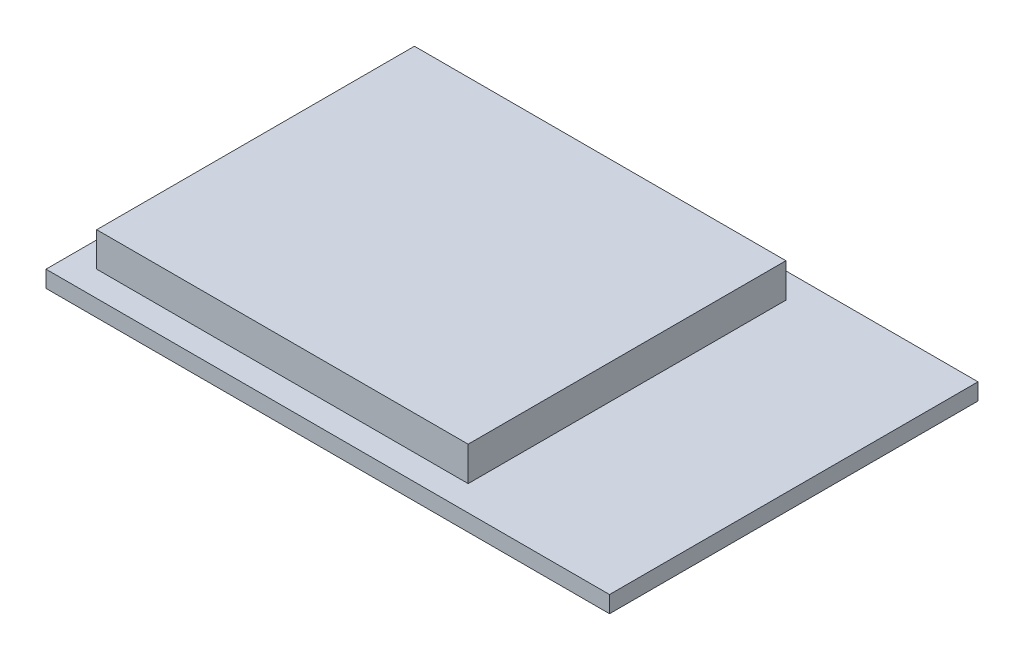
ISO-10303-21;
HEADER;
FILE_DESCRIPTION(('STEP AP214'),'2;1');
FILE_NAME('part.step','',(''),(''),'','','');
FILE_SCHEMA(('AUTOMOTIVE_DESIGN { 1 0 10303 214 1 1 1 1 }'));
ENDSEC;
DATA;
#1=APPLICATION_CONTEXT('core data for automotive mechanical design processes');
#2=APPLICATION_PROTOCOL_DEFINITION('international standard','automotive_design',2000,#1);
#3=PRODUCT_CONTEXT('',#1,'mechanical');
#4=PRODUCT('Part','Part','',(#3));
#5=PRODUCT_RELATED_PRODUCT_CATEGORY('part','',(#4));
#6=PRODUCT_DEFINITION_FORMATION('','',#4);
#7=PRODUCT_DEFINITION_CONTEXT('part definition',#1,'design');
#8=PRODUCT_DEFINITION('design','',#6,#7);
#9=PRODUCT_DEFINITION_SHAPE('','',#8);
#10=(LENGTH_UNIT() NAMED_UNIT(*) SI_UNIT(.MILLI.,.METRE.));
#11=(NAMED_UNIT(*) PLANE_ANGLE_UNIT() SI_UNIT($,.RADIAN.));
#12=(NAMED_UNIT(*) SI_UNIT($,.STERADIAN.) SOLID_ANGLE_UNIT());
#13=UNCERTAINTY_MEASURE_WITH_UNIT(LENGTH_MEASURE(1.E-05),#10,'distance_accuracy_value','');
#14=(GEOMETRIC_REPRESENTATION_CONTEXT(3) GLOBAL_UNCERTAINTY_ASSIGNED_CONTEXT((#13)) GLOBAL_UNIT_ASSIGNED_CONTEXT((#10,
#11,#12)) REPRESENTATION_CONTEXT('',''));
#15=CARTESIAN_POINT('',(0.,0.,0.));
#16=DIRECTION('',(0.,0.,1.));
#17=DIRECTION('',(1.,0.,0.));
#18=AXIS2_PLACEMENT_3D('',#15,#16,#17);
#19=CARTESIAN_POINT('',(0.,1.,0.));
#20=DIRECTION('',(0.,1.,0.));
#21=DIRECTION('',(0.,0.,1.));
#22=AXIS2_PLACEMENT_3D('',#19,#20,#21);
#23=PLANE('',#22);
#24=DIRECTION('',(0.,0.,1.));
#25=VECTOR('',#24,1.);
#26=CARTESIAN_POINT('',(0.,1.,-11.05));
#27=LINE('',#26,#25);
#28=CARTESIAN_POINT('',(0.,1.,-11.05));
#29=VERTEX_POINT('',#28);
#30=CARTESIAN_POINT('',(0.,1.,11.05));
#31=VERTEX_POINT('',#30);
#32=EDGE_CURVE('E149',#29,#31,#27,.T.);
#33=ORIENTED_EDGE('',*,*,#32,.T.);
#34=DIRECTION('',(1.,0.,0.));
#35=VECTOR('',#34,1.);
#36=CARTESIAN_POINT('',(0.,1.,11.05));
#37=LINE('',#36,#35);
#38=CARTESIAN_POINT('',(33.8,1.,11.05));
#39=VERTEX_POINT('',#38);
#40=EDGE_CURVE('E89',#31,#39,#37,.T.);
#41=ORIENTED_EDGE('',*,*,#40,.T.);
#42=DIRECTION('',(0.,0.,-1.));
#43=VECTOR('',#42,1.);
#44=CARTESIAN_POINT('',(33.8,1.,-11.05));
#45=LINE('',#44,#43);
#46=CARTESIAN_POINT('',(33.8,1.,-11.05));
#47=VERTEX_POINT('',#46);
#48=EDGE_CURVE('E152',#39,#47,#45,.T.);
#49=ORIENTED_EDGE('',*,*,#48,.T.);
#50=DIRECTION('',(-1.,0.,0.));
#51=VECTOR('',#50,1.);
#52=CARTESIAN_POINT('',(0.,1.,-11.05));
#53=LINE('',#52,#51);
#54=EDGE_CURVE('E61',#47,#29,#53,.T.);
#55=ORIENTED_EDGE('',*,*,#54,.T.);
#56=EDGE_LOOP('',(#33,#41,#49,#55));
#57=FACE_BOUND('',#56,.T.);
#58=DIRECTION('',(1.,0.,0.));
#59=VECTOR('',#58,1.);
#60=CARTESIAN_POINT('',(0.,1.,-9.53));
#61=LINE('',#60,#59);
#62=CARTESIAN_POINT('',(1.52,1.,-9.53));
#63=VERTEX_POINT('',#62);
#64=CARTESIAN_POINT('',(23.8,1.,-9.53));
#65=VERTEX_POINT('',#64);
#66=EDGE_CURVE('E145',#63,#65,#61,.T.);
#67=ORIENTED_EDGE('',*,*,#66,.T.);
#68=DIRECTION('',(0.,0.,1.));
#69=VECTOR('',#68,1.);
#70=CARTESIAN_POINT('',(23.8,1.,0.));
#71=LINE('',#70,#69);
#72=CARTESIAN_POINT('',(23.8,1.,9.53));
#73=VERTEX_POINT('',#72);
#74=EDGE_CURVE('E134',#65,#73,#71,.T.);
#75=ORIENTED_EDGE('',*,*,#74,.T.);
#76=DIRECTION('',(-1.,0.,0.));
#77=VECTOR('',#76,1.);
#78=CARTESIAN_POINT('',(0.,1.,9.53));
#79=LINE('',#78,#77);
#80=CARTESIAN_POINT('',(1.52,1.,9.53));
#81=VERTEX_POINT('',#80);
#82=EDGE_CURVE('E135',#73,#81,#79,.T.);
#83=ORIENTED_EDGE('',*,*,#82,.T.);
#84=DIRECTION('',(0.,0.,-1.));
#85=VECTOR('',#84,1.);
#86=CARTESIAN_POINT('',(1.52,1.,0.));
#87=LINE('',#86,#85);
#88=EDGE_CURVE('E138',#81,#63,#87,.T.);
#89=ORIENTED_EDGE('',*,*,#88,.T.);
#90=EDGE_LOOP('',(#67,#75,#83,#89));
#91=FACE_BOUND('',#90,.T.);
#92=ADVANCED_FACE('F37',(#57,#91),#23,.T.);
#93=CARTESIAN_POINT('',(0.,1.,-11.05));
#94=DIRECTION('',(1.,0.,0.));
#95=DIRECTION('',(0.,0.,-1.));
#96=AXIS2_PLACEMENT_3D('',#93,#94,#95);
#97=PLANE('',#96);
#98=DIRECTION('',(0.,0.,1.));
#99=VECTOR('',#98,1.);
#100=CARTESIAN_POINT('',(0.,0.,-11.05));
#101=LINE('',#100,#99);
#102=CARTESIAN_POINT('',(0.,0.,-11.05));
#103=VERTEX_POINT('',#102);
#104=CARTESIAN_POINT('',(0.,0.,11.05));
#105=VERTEX_POINT('',#104);
#106=EDGE_CURVE('E148',#103,#105,#101,.T.);
#107=ORIENTED_EDGE('',*,*,#106,.T.);
#108=DIRECTION('',(0.,-1.,0.));
#109=VECTOR('',#108,1.);
#110=CARTESIAN_POINT('',(0.,1.,11.05));
#111=LINE('',#110,#109);
#112=EDGE_CURVE('E11',#31,#105,#111,.T.);
#113=ORIENTED_EDGE('',*,*,#112,.F.);
#114=ORIENTED_EDGE('',*,*,#32,.F.);
#115=DIRECTION('',(0.,-1.,0.));
#116=VECTOR('',#115,1.);
#117=CARTESIAN_POINT('',(0.,1.,-11.05));
#118=LINE('',#117,#116);
#119=EDGE_CURVE('E155',#29,#103,#118,.T.);
#120=ORIENTED_EDGE('',*,*,#119,.T.);
#121=EDGE_LOOP('',(#107,#113,#114,#120));
#122=FACE_BOUND('',#121,.T.);
#123=ADVANCED_FACE('F39',(#122),#97,.F.);
#124=CARTESIAN_POINT('',(0.,1.,11.05));
#125=DIRECTION('',(0.,0.,-1.));
#126=DIRECTION('',(-1.,0.,0.));
#127=AXIS2_PLACEMENT_3D('',#124,#125,#126);
#128=PLANE('',#127);
#129=DIRECTION('',(1.,0.,0.));
#130=VECTOR('',#129,1.);
#131=CARTESIAN_POINT('',(0.,0.,11.05));
#132=LINE('',#131,#130);
#133=CARTESIAN_POINT('',(33.8,0.,11.05));
#134=VERTEX_POINT('',#133);
#135=EDGE_CURVE('E158',#105,#134,#132,.T.);
#136=ORIENTED_EDGE('',*,*,#135,.T.);
#137=DIRECTION('',(0.,-1.,0.));
#138=VECTOR('',#137,1.);
#139=CARTESIAN_POINT('',(33.8,1.,11.05));
#140=LINE('',#139,#138);
#141=EDGE_CURVE('E45',#39,#134,#140,.T.);
#142=ORIENTED_EDGE('',*,*,#141,.F.);
#143=ORIENTED_EDGE('',*,*,#40,.F.);
#144=ORIENTED_EDGE('',*,*,#112,.T.);
#145=EDGE_LOOP('',(#136,#142,#143,#144));
#146=FACE_BOUND('',#145,.T.);
#147=ADVANCED_FACE('F185',(#146),#128,.F.);
#148=CARTESIAN_POINT('',(33.8,1.,-11.05));
#149=DIRECTION('',(-1.,0.,0.));
#150=DIRECTION('',(0.,0.,1.));
#151=AXIS2_PLACEMENT_3D('',#148,#149,#150);
#152=PLANE('',#151);
#153=DIRECTION('',(0.,0.,-1.));
#154=VECTOR('',#153,1.);
#155=CARTESIAN_POINT('',(33.8,0.,-11.05));
#156=LINE('',#155,#154);
#157=CARTESIAN_POINT('',(33.8,0.,-11.05));
#158=VERTEX_POINT('',#157);
#159=EDGE_CURVE('E160',#134,#158,#156,.T.);
#160=ORIENTED_EDGE('',*,*,#159,.T.);
#161=DIRECTION('',(0.,-1.,0.));
#162=VECTOR('',#161,1.);
#163=CARTESIAN_POINT('',(33.8,1.,-11.05));
#164=LINE('',#163,#162);
#165=EDGE_CURVE('E164',#47,#158,#164,.T.);
#166=ORIENTED_EDGE('',*,*,#165,.F.);
#167=ORIENTED_EDGE('',*,*,#48,.F.);
#168=ORIENTED_EDGE('',*,*,#141,.T.);
#169=EDGE_LOOP('',(#160,#166,#167,#168));
#170=FACE_BOUND('',#169,.T.);
#171=ADVANCED_FACE('F169',(#170),#152,.F.);
#172=CARTESIAN_POINT('',(0.,1.,-11.05));
#173=DIRECTION('',(0.,0.,1.));
#174=DIRECTION('',(1.,0.,0.));
#175=AXIS2_PLACEMENT_3D('',#172,#173,#174);
#176=PLANE('',#175);
#177=DIRECTION('',(-1.,0.,0.));
#178=VECTOR('',#177,1.);
#179=CARTESIAN_POINT('',(0.,0.,-11.05));
#180=LINE('',#179,#178);
#181=EDGE_CURVE('E82',#158,#103,#180,.T.);
#182=ORIENTED_EDGE('',*,*,#181,.T.);
#183=ORIENTED_EDGE('',*,*,#119,.F.);
#184=ORIENTED_EDGE('',*,*,#54,.F.);
#185=ORIENTED_EDGE('',*,*,#165,.T.);
#186=EDGE_LOOP('',(#182,#183,#184,#185));
#187=FACE_BOUND('',#186,.T.);
#188=ADVANCED_FACE('F177',(#187),#176,.F.);
#189=CARTESIAN_POINT('',(0.,0.,0.));
#190=DIRECTION('',(0.,1.,0.));
#191=DIRECTION('',(0.,0.,1.));
#192=AXIS2_PLACEMENT_3D('',#189,#190,#191);
#193=PLANE('',#192);
#194=ORIENTED_EDGE('',*,*,#106,.F.);
#195=ORIENTED_EDGE('',*,*,#181,.F.);
#196=ORIENTED_EDGE('',*,*,#159,.F.);
#197=ORIENTED_EDGE('',*,*,#135,.F.);
#198=EDGE_LOOP('',(#194,#195,#196,#197));
#199=FACE_BOUND('',#198,.T.);
#200=ADVANCED_FACE('F173',(#199),#193,.F.);
#201=CARTESIAN_POINT('',(23.8,3.05,-9.53));
#202=DIRECTION('',(-1.,0.,0.));
#203=DIRECTION('',(0.,0.,1.));
#204=AXIS2_PLACEMENT_3D('',#201,#202,#203);
#205=PLANE('',#204);
#206=ORIENTED_EDGE('',*,*,#74,.F.);
#207=DIRECTION('',(0.,-1.,0.));
#208=VECTOR('',#207,1.);
#209=CARTESIAN_POINT('',(23.8,3.05,-9.53));
#210=LINE('',#209,#208);
#211=CARTESIAN_POINT('',(23.8,3.05,-9.53));
#212=VERTEX_POINT('',#211);
#213=EDGE_CURVE('E116',#212,#65,#210,.T.);
#214=ORIENTED_EDGE('',*,*,#213,.F.);
#215=DIRECTION('',(0.,0.,-1.));
#216=VECTOR('',#215,1.);
#217=CARTESIAN_POINT('',(23.8,3.05,-9.53));
#218=LINE('',#217,#216);
#219=CARTESIAN_POINT('',(23.8,3.05,9.53));
#220=VERTEX_POINT('',#219);
#221=EDGE_CURVE('E123',#220,#212,#218,.T.);
#222=ORIENTED_EDGE('',*,*,#221,.F.);
#223=DIRECTION('',(0.,-1.,0.));
#224=VECTOR('',#223,1.);
#225=CARTESIAN_POINT('',(23.8,3.05,9.53));
#226=LINE('',#225,#224);
#227=EDGE_CURVE('E269',#220,#73,#226,.T.);
#228=ORIENTED_EDGE('',*,*,#227,.T.);
#229=EDGE_LOOP('',(#206,#214,#222,#228));
#230=FACE_BOUND('',#229,.T.);
#231=ADVANCED_FACE('F132',(#230),#205,.F.);
#232=CARTESIAN_POINT('',(23.8,3.05,-9.53));
#233=DIRECTION('',(0.,0.,1.));
#234=DIRECTION('',(1.,0.,0.));
#235=AXIS2_PLACEMENT_3D('',#232,#233,#234);
#236=PLANE('',#235);
#237=ORIENTED_EDGE('',*,*,#66,.F.);
#238=DIRECTION('',(0.,-1.,0.));
#239=VECTOR('',#238,1.);
#240=CARTESIAN_POINT('',(1.52,3.05,-9.53));
#241=LINE('',#240,#239);
#242=CARTESIAN_POINT('',(1.52,3.05,-9.53));
#243=VERTEX_POINT('',#242);
#244=EDGE_CURVE('E119',#243,#63,#241,.T.);
#245=ORIENTED_EDGE('',*,*,#244,.F.);
#246=DIRECTION('',(-1.,0.,0.));
#247=VECTOR('',#246,1.);
#248=CARTESIAN_POINT('',(23.8,3.05,-9.53));
#249=LINE('',#248,#247);
#250=EDGE_CURVE('E112',#212,#243,#249,.T.);
#251=ORIENTED_EDGE('',*,*,#250,.F.);
#252=ORIENTED_EDGE('',*,*,#213,.T.);
#253=EDGE_LOOP('',(#237,#245,#251,#252));
#254=FACE_BOUND('',#253,.T.);
#255=ADVANCED_FACE('F114',(#254),#236,.F.);
#256=CARTESIAN_POINT('',(1.52,3.05,-9.53));
#257=DIRECTION('',(1.,0.,0.));
#258=DIRECTION('',(0.,0.,-1.));
#259=AXIS2_PLACEMENT_3D('',#256,#257,#258);
#260=PLANE('',#259);
#261=ORIENTED_EDGE('',*,*,#88,.F.);
#262=DIRECTION('',(0.,-1.,0.));
#263=VECTOR('',#262,1.);
#264=CARTESIAN_POINT('',(1.52,3.05,9.53));
#265=LINE('',#264,#263);
#266=CARTESIAN_POINT('',(1.52,3.05,9.53));
#267=VERTEX_POINT('',#266);
#268=EDGE_CURVE('E52',#267,#81,#265,.T.);
#269=ORIENTED_EDGE('',*,*,#268,.F.);
#270=DIRECTION('',(0.,0.,1.));
#271=VECTOR('',#270,1.);
#272=CARTESIAN_POINT('',(1.52,3.05,-9.53));
#273=LINE('',#272,#271);
#274=EDGE_CURVE('E122',#243,#267,#273,.T.);
#275=ORIENTED_EDGE('',*,*,#274,.F.);
#276=ORIENTED_EDGE('',*,*,#244,.T.);
#277=EDGE_LOOP('',(#261,#269,#275,#276));
#278=FACE_BOUND('',#277,.T.);
#279=ADVANCED_FACE('F198',(#278),#260,.F.);
#280=CARTESIAN_POINT('',(23.8,3.05,9.53));
#281=DIRECTION('',(0.,0.,-1.));
#282=DIRECTION('',(-1.,0.,0.));
#283=AXIS2_PLACEMENT_3D('',#280,#281,#282);
#284=PLANE('',#283);
#285=ORIENTED_EDGE('',*,*,#82,.F.);
#286=ORIENTED_EDGE('',*,*,#227,.F.);
#287=DIRECTION('',(1.,0.,0.));
#288=VECTOR('',#287,1.);
#289=CARTESIAN_POINT('',(23.8,3.05,9.53));
#290=LINE('',#289,#288);
#291=EDGE_CURVE('E127',#267,#220,#290,.T.);
#292=ORIENTED_EDGE('',*,*,#291,.F.);
#293=ORIENTED_EDGE('',*,*,#268,.T.);
#294=EDGE_LOOP('',(#285,#286,#292,#293));
#295=FACE_BOUND('',#294,.T.);
#296=ADVANCED_FACE('F201',(#295),#284,.F.);
#297=CARTESIAN_POINT('',(0.,3.05,0.));
#298=DIRECTION('',(0.,-1.,0.));
#299=DIRECTION('',(0.,0.,-1.));
#300=AXIS2_PLACEMENT_3D('',#297,#298,#299);
#301=PLANE('',#300);
#302=ORIENTED_EDGE('',*,*,#221,.T.);
#303=ORIENTED_EDGE('',*,*,#250,.T.);
#304=ORIENTED_EDGE('',*,*,#274,.T.);
#305=ORIENTED_EDGE('',*,*,#291,.T.);
#306=EDGE_LOOP('',(#302,#303,#304,#305));
#307=FACE_BOUND('',#306,.T.);
#308=ADVANCED_FACE('F126',(#307),#301,.F.);
#309=CLOSED_SHELL('',(#92,#123,#147,#171,#188,#200,#231,#255,#279,#296,#308));
#310=MANIFOLD_SOLID_BREP('B2',#309);
#311=ADVANCED_BREP_SHAPE_REPRESENTATION('',(#18,#310),#14);
#312=SHAPE_DEFINITION_REPRESENTATION(#9,#311);
ENDSEC;
END-ISO-10303-21;
